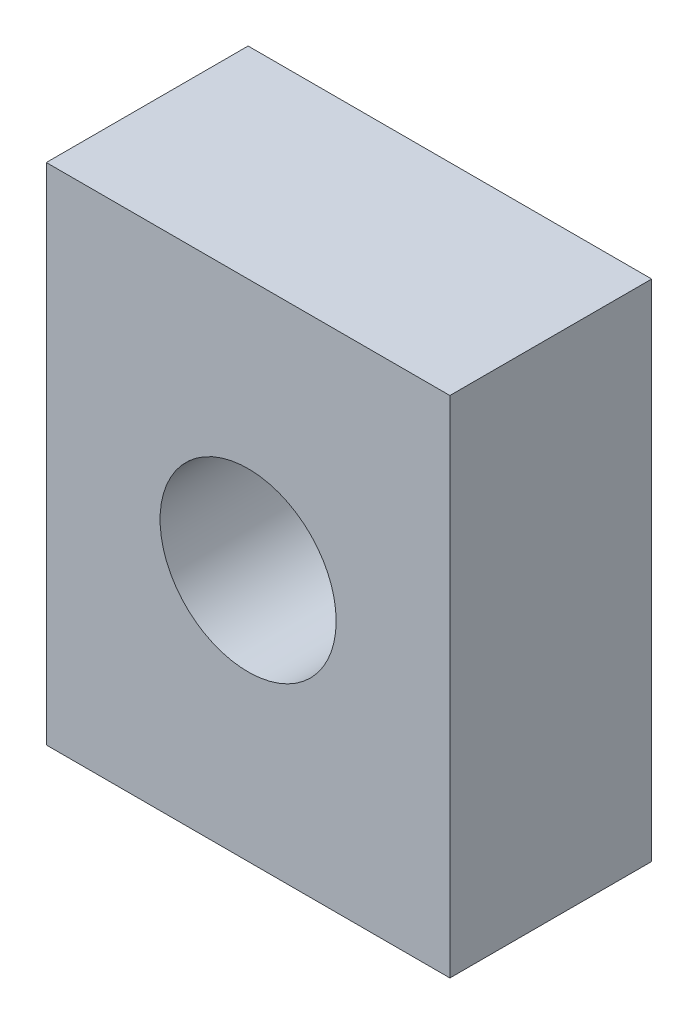
ISO-10303-21;
HEADER;
FILE_DESCRIPTION(('STEP AP214'),'2;1');
FILE_NAME('part.step','',(''),(''),'','','');
FILE_SCHEMA(('AUTOMOTIVE_DESIGN { 1 0 10303 214 1 1 1 1 }'));
ENDSEC;
DATA;
#1=APPLICATION_CONTEXT('core data for automotive mechanical design processes');
#2=APPLICATION_PROTOCOL_DEFINITION('international standard','automotive_design',2000,#1);
#3=PRODUCT_CONTEXT('',#1,'mechanical');
#4=PRODUCT('Part','Part','',(#3));
#5=PRODUCT_RELATED_PRODUCT_CATEGORY('part','',(#4));
#6=PRODUCT_DEFINITION_FORMATION('','',#4);
#7=PRODUCT_DEFINITION_CONTEXT('part definition',#1,'design');
#8=PRODUCT_DEFINITION('design','',#6,#7);
#9=PRODUCT_DEFINITION_SHAPE('','',#8);
#10=(LENGTH_UNIT() NAMED_UNIT(*) SI_UNIT(.MILLI.,.METRE.));
#11=(NAMED_UNIT(*) PLANE_ANGLE_UNIT() SI_UNIT($,.RADIAN.));
#12=(NAMED_UNIT(*) SI_UNIT($,.STERADIAN.) SOLID_ANGLE_UNIT());
#13=UNCERTAINTY_MEASURE_WITH_UNIT(LENGTH_MEASURE(1.E-05),#10,'distance_accuracy_value','');
#14=(GEOMETRIC_REPRESENTATION_CONTEXT(3) GLOBAL_UNCERTAINTY_ASSIGNED_CONTEXT((#13)) GLOBAL_UNIT_ASSIGNED_CONTEXT((#10,
#11,#12)) REPRESENTATION_CONTEXT('',''));
#15=CARTESIAN_POINT('',(0.,0.,0.));
#16=DIRECTION('',(0.,0.,1.));
#17=DIRECTION('',(1.,0.,0.));
#18=AXIS2_PLACEMENT_3D('',#15,#16,#17);
#19=CARTESIAN_POINT('',(50.8,-63.5,50.8));
#20=DIRECTION('',(-1.,0.,0.));
#21=DIRECTION('',(0.,0.,1.));
#22=AXIS2_PLACEMENT_3D('',#19,#20,#21);
#23=PLANE('',#22);
#24=DIRECTION('',(0.,1.,0.));
#25=VECTOR('',#24,1.);
#26=CARTESIAN_POINT('',(50.8,-63.5,0.));
#27=LINE('',#26,#25);
#28=CARTESIAN_POINT('',(50.8,-63.5,0.));
#29=VERTEX_POINT('',#28);
#30=CARTESIAN_POINT('',(50.8,63.5,0.));
#31=VERTEX_POINT('',#30);
#32=EDGE_CURVE('E97',#29,#31,#27,.T.);
#33=ORIENTED_EDGE('',*,*,#32,.T.);
#34=DIRECTION('',(0.,0.,-1.));
#35=VECTOR('',#34,1.);
#36=CARTESIAN_POINT('',(50.8,63.5,50.8));
#37=LINE('',#36,#35);
#38=CARTESIAN_POINT('',(50.8,63.5,50.8));
#39=VERTEX_POINT('',#38);
#40=EDGE_CURVE('E11',#39,#31,#37,.T.);
#41=ORIENTED_EDGE('',*,*,#40,.F.);
#42=DIRECTION('',(0.,1.,0.));
#43=VECTOR('',#42,1.);
#44=CARTESIAN_POINT('',(50.8,-63.5,50.8));
#45=LINE('',#44,#43);
#46=CARTESIAN_POINT('',(50.8,-63.5,50.8));
#47=VERTEX_POINT('',#46);
#48=EDGE_CURVE('E85',#47,#39,#45,.T.);
#49=ORIENTED_EDGE('',*,*,#48,.F.);
#50=DIRECTION('',(0.,0.,-1.));
#51=VECTOR('',#50,1.);
#52=CARTESIAN_POINT('',(50.8,-63.5,50.8));
#53=LINE('',#52,#51);
#54=EDGE_CURVE('E93',#47,#29,#53,.T.);
#55=ORIENTED_EDGE('',*,*,#54,.T.);
#56=EDGE_LOOP('',(#33,#41,#49,#55));
#57=FACE_BOUND('',#56,.T.);
#58=ADVANCED_FACE('F34',(#57),#23,.F.);
#59=CARTESIAN_POINT('',(-50.8,63.5,50.8));
#60=DIRECTION('',(0.,-1.,0.));
#61=DIRECTION('',(0.,0.,-1.));
#62=AXIS2_PLACEMENT_3D('',#59,#60,#61);
#63=PLANE('',#62);
#64=DIRECTION('',(-1.,0.,0.));
#65=VECTOR('',#64,1.);
#66=CARTESIAN_POINT('',(-50.8,63.5,0.));
#67=LINE('',#66,#65);
#68=CARTESIAN_POINT('',(-50.8,63.5,0.));
#69=VERTEX_POINT('',#68);
#70=EDGE_CURVE('E89',#31,#69,#67,.T.);
#71=ORIENTED_EDGE('',*,*,#70,.T.);
#72=DIRECTION('',(0.,0.,-1.));
#73=VECTOR('',#72,1.);
#74=CARTESIAN_POINT('',(-50.8,63.5,50.8));
#75=LINE('',#74,#73);
#76=CARTESIAN_POINT('',(-50.8,63.5,50.8));
#77=VERTEX_POINT('',#76);
#78=EDGE_CURVE('E42',#77,#69,#75,.T.);
#79=ORIENTED_EDGE('',*,*,#78,.F.);
#80=DIRECTION('',(-1.,0.,0.));
#81=VECTOR('',#80,1.);
#82=CARTESIAN_POINT('',(-50.8,63.5,50.8));
#83=LINE('',#82,#81);
#84=EDGE_CURVE('E80',#39,#77,#83,.T.);
#85=ORIENTED_EDGE('',*,*,#84,.F.);
#86=ORIENTED_EDGE('',*,*,#40,.T.);
#87=EDGE_LOOP('',(#71,#79,#85,#86));
#88=FACE_BOUND('',#87,.T.);
#89=ADVANCED_FACE('F88',(#88),#63,.F.);
#90=CARTESIAN_POINT('',(-50.8,-63.5,50.8));
#91=DIRECTION('',(1.,0.,0.));
#92=DIRECTION('',(0.,0.,-1.));
#93=AXIS2_PLACEMENT_3D('',#90,#91,#92);
#94=PLANE('',#93);
#95=DIRECTION('',(0.,-1.,0.));
#96=VECTOR('',#95,1.);
#97=CARTESIAN_POINT('',(-50.8,-63.5,0.));
#98=LINE('',#97,#96);
#99=CARTESIAN_POINT('',(-50.8,-63.5,0.));
#100=VERTEX_POINT('',#99);
#101=EDGE_CURVE('E67',#69,#100,#98,.T.);
#102=ORIENTED_EDGE('',*,*,#101,.T.);
#103=DIRECTION('',(0.,0.,-1.));
#104=VECTOR('',#103,1.);
#105=CARTESIAN_POINT('',(-50.8,-63.5,50.8));
#106=LINE('',#105,#104);
#107=CARTESIAN_POINT('',(-50.8,-63.5,50.8));
#108=VERTEX_POINT('',#107);
#109=EDGE_CURVE('E90',#108,#100,#106,.T.);
#110=ORIENTED_EDGE('',*,*,#109,.F.);
#111=DIRECTION('',(0.,-1.,0.));
#112=VECTOR('',#111,1.);
#113=CARTESIAN_POINT('',(-50.8,-63.5,50.8));
#114=LINE('',#113,#112);
#115=EDGE_CURVE('E83',#77,#108,#114,.T.);
#116=ORIENTED_EDGE('',*,*,#115,.F.);
#117=ORIENTED_EDGE('',*,*,#78,.T.);
#118=EDGE_LOOP('',(#102,#110,#116,#117));
#119=FACE_BOUND('',#118,.T.);
#120=ADVANCED_FACE('F91',(#119),#94,.F.);
#121=CARTESIAN_POINT('',(-50.8,-63.5,50.8));
#122=DIRECTION('',(0.,1.,0.));
#123=DIRECTION('',(0.,0.,1.));
#124=AXIS2_PLACEMENT_3D('',#121,#122,#123);
#125=PLANE('',#124);
#126=DIRECTION('',(1.,0.,0.));
#127=VECTOR('',#126,1.);
#128=CARTESIAN_POINT('',(-50.8,-63.5,0.));
#129=LINE('',#128,#127);
#130=EDGE_CURVE('E73',#100,#29,#129,.T.);
#131=ORIENTED_EDGE('',*,*,#130,.T.);
#132=ORIENTED_EDGE('',*,*,#54,.F.);
#133=DIRECTION('',(1.,0.,0.));
#134=VECTOR('',#133,1.);
#135=CARTESIAN_POINT('',(-50.8,-63.5,50.8));
#136=LINE('',#135,#134);
#137=EDGE_CURVE('E50',#108,#47,#136,.T.);
#138=ORIENTED_EDGE('',*,*,#137,.F.);
#139=ORIENTED_EDGE('',*,*,#109,.T.);
#140=EDGE_LOOP('',(#131,#132,#138,#139));
#141=FACE_BOUND('',#140,.T.);
#142=ADVANCED_FACE('F105',(#141),#125,.F.);
#143=CARTESIAN_POINT('',(0.,0.,50.8));
#144=DIRECTION('',(0.,0.,-1.));
#145=DIRECTION('',(-1.,0.,0.));
#146=AXIS2_PLACEMENT_3D('',#143,#144,#145);
#147=PLANE('',#146);
#148=CARTESIAN_POINT('',(0.,0.,50.8));
#149=DIRECTION('',(0.,0.,1.));
#150=DIRECTION('',(1.,0.,0.));
#151=AXIS2_PLACEMENT_3D('',#148,#149,#150);
#152=CIRCLE('',#151,22.1659311446517);
#153=CARTESIAN_POINT('',(22.1659311446517,0.,50.8));
#154=VERTEX_POINT('',#153);
#155=EDGE_CURVE('E111',#154,#154,#152,.T.);
#156=ORIENTED_EDGE('',*,*,#155,.F.);
#157=EDGE_LOOP('',(#156));
#158=FACE_BOUND('',#157,.T.);
#159=ORIENTED_EDGE('',*,*,#48,.T.);
#160=ORIENTED_EDGE('',*,*,#84,.T.);
#161=ORIENTED_EDGE('',*,*,#115,.T.);
#162=ORIENTED_EDGE('',*,*,#137,.T.);
#163=EDGE_LOOP('',(#159,#160,#161,#162));
#164=FACE_BOUND('',#163,.T.);
#165=ADVANCED_FACE('F81',(#158,#164),#147,.F.);
#166=CARTESIAN_POINT('',(0.,0.,0.));
#167=DIRECTION('',(0.,0.,-1.));
#168=DIRECTION('',(-1.,0.,0.));
#169=AXIS2_PLACEMENT_3D('',#166,#167,#168);
#170=PLANE('',#169);
#171=CARTESIAN_POINT('',(0.,0.,0.));
#172=DIRECTION('',(0.,0.,1.));
#173=DIRECTION('',(1.,0.,0.));
#174=AXIS2_PLACEMENT_3D('',#171,#172,#173);
#175=CIRCLE('',#174,22.1659311446517);
#176=CARTESIAN_POINT('',(22.1659311446517,0.,0.));
#177=VERTEX_POINT('',#176);
#178=EDGE_CURVE('E100',#177,#177,#175,.T.);
#179=ORIENTED_EDGE('',*,*,#178,.T.);
#180=EDGE_LOOP('',(#179));
#181=FACE_BOUND('',#180,.T.);
#182=ORIENTED_EDGE('',*,*,#32,.F.);
#183=ORIENTED_EDGE('',*,*,#130,.F.);
#184=ORIENTED_EDGE('',*,*,#101,.F.);
#185=ORIENTED_EDGE('',*,*,#70,.F.);
#186=EDGE_LOOP('',(#182,#183,#184,#185));
#187=FACE_BOUND('',#186,.T.);
#188=ADVANCED_FACE('F108',(#181,#187),#170,.T.);
#189=CARTESIAN_POINT('',(0.,0.,0.));
#190=DIRECTION('',(0.,0.,1.));
#191=DIRECTION('',(1.,0.,0.));
#192=AXIS2_PLACEMENT_3D('',#189,#190,#191);
#193=CYLINDRICAL_SURFACE('',#192,22.1659311446517);
#194=ORIENTED_EDGE('',*,*,#178,.F.);
#195=EDGE_LOOP('',(#194));
#196=FACE_BOUND('',#195,.T.);
#197=ORIENTED_EDGE('',*,*,#155,.T.);
#198=EDGE_LOOP('',(#197));
#199=FACE_BOUND('',#198,.T.);
#200=ADVANCED_FACE('F118',(#196,#199),#193,.F.);
#201=CLOSED_SHELL('',(#58,#89,#120,#142,#165,#188,#200));
#202=MANIFOLD_SOLID_BREP('B2',#201);
#203=ADVANCED_BREP_SHAPE_REPRESENTATION('',(#18,#202),#14);
#204=SHAPE_DEFINITION_REPRESENTATION(#9,#203);
ENDSEC;
END-ISO-10303-21;
